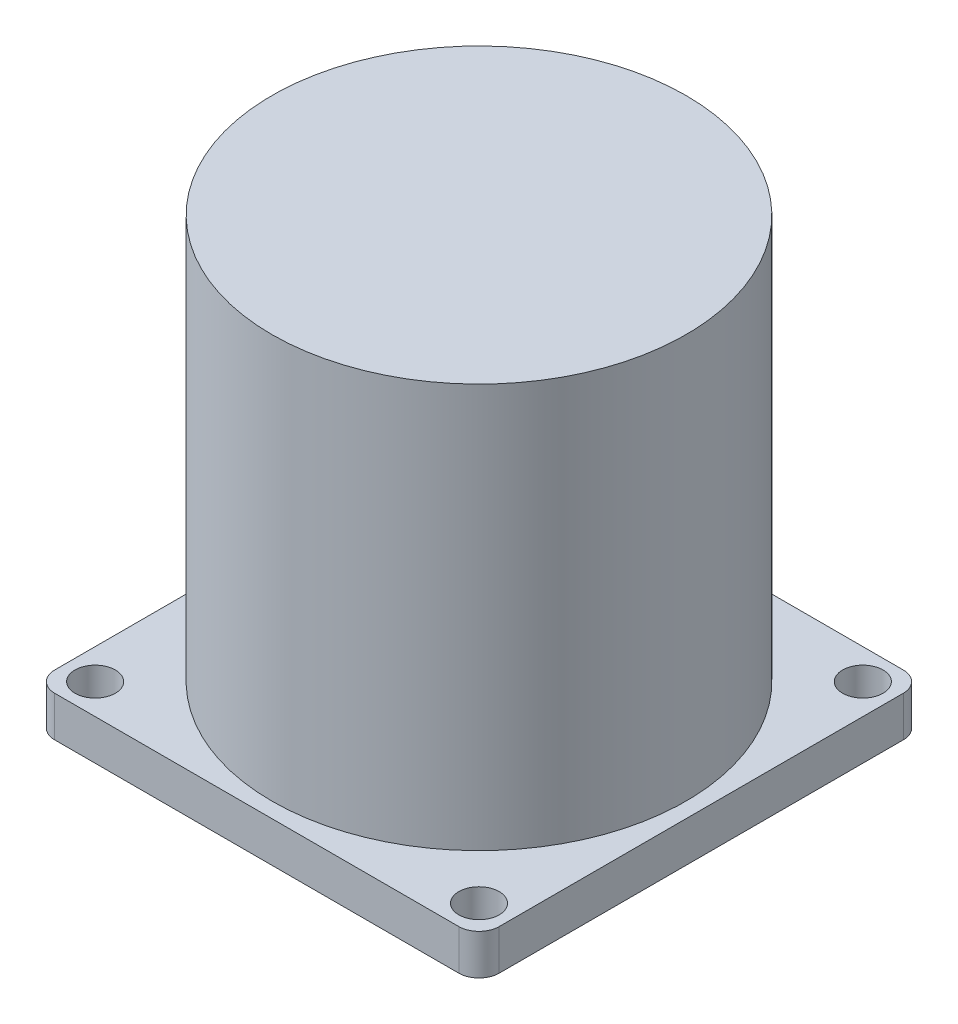
ISO-10303-21;
HEADER;
FILE_DESCRIPTION(('STEP AP214'),'2;1');
FILE_NAME('part.step','',(''),(''),'','','');
FILE_SCHEMA(('AUTOMOTIVE_DESIGN { 1 0 10303 214 1 1 1 1 }'));
ENDSEC;
DATA;
#1=APPLICATION_CONTEXT('core data for automotive mechanical design processes');
#2=APPLICATION_PROTOCOL_DEFINITION('international standard','automotive_design',2000,#1);
#3=PRODUCT_CONTEXT('',#1,'mechanical');
#4=PRODUCT('Part','Part','',(#3));
#5=PRODUCT_RELATED_PRODUCT_CATEGORY('part','',(#4));
#6=PRODUCT_DEFINITION_FORMATION('','',#4);
#7=PRODUCT_DEFINITION_CONTEXT('part definition',#1,'design');
#8=PRODUCT_DEFINITION('design','',#6,#7);
#9=PRODUCT_DEFINITION_SHAPE('','',#8);
#10=(LENGTH_UNIT() NAMED_UNIT(*) SI_UNIT(.MILLI.,.METRE.));
#11=(NAMED_UNIT(*) PLANE_ANGLE_UNIT() SI_UNIT($,.RADIAN.));
#12=(NAMED_UNIT(*) SI_UNIT($,.STERADIAN.) SOLID_ANGLE_UNIT());
#13=UNCERTAINTY_MEASURE_WITH_UNIT(LENGTH_MEASURE(1.E-05),#10,'distance_accuracy_value','');
#14=(GEOMETRIC_REPRESENTATION_CONTEXT(3) GLOBAL_UNCERTAINTY_ASSIGNED_CONTEXT((#13)) GLOBAL_UNIT_ASSIGNED_CONTEXT((#10,
#11,#12)) REPRESENTATION_CONTEXT('',''));
#15=CARTESIAN_POINT('',(0.,0.,0.));
#16=DIRECTION('',(0.,0.,1.));
#17=DIRECTION('',(1.,0.,0.));
#18=AXIS2_PLACEMENT_3D('',#15,#16,#17);
#19=CARTESIAN_POINT('',(0.,20.,0.));
#20=DIRECTION('',(0.,1.,0.));
#21=DIRECTION('',(0.,0.,1.));
#22=AXIS2_PLACEMENT_3D('',#19,#20,#21);
#23=PLANE('',#22);
#24=CARTESIAN_POINT('',(0.,20.,0.));
#25=DIRECTION('',(0.,1.,0.));
#26=DIRECTION('',(0.,0.,1.));
#27=AXIS2_PLACEMENT_3D('',#24,#25,#26);
#28=CIRCLE('',#27,102.5);
#29=CARTESIAN_POINT('',(0.,20.,102.5));
#30=VERTEX_POINT('',#29);
#31=EDGE_CURVE('E11',#30,#30,#28,.T.);
#32=ORIENTED_EDGE('',*,*,#31,.F.);
#33=EDGE_LOOP('',(#32));
#34=FACE_BOUND('',#33,.T.);
#35=CARTESIAN_POINT('',(95.0000000000054,20.,94.9999999999947));
#36=DIRECTION('',(0.,1.,0.));
#37=DIRECTION('',(0.,0.,1.));
#38=AXIS2_PLACEMENT_3D('',#35,#36,#37);
#39=CIRCLE('',#38,10.0000000000075);
#40=CARTESIAN_POINT('',(95.0000000000054,20.,105.000000000002));
#41=VERTEX_POINT('',#40);
#42=EDGE_CURVE('E188',#41,#41,#39,.T.);
#43=ORIENTED_EDGE('',*,*,#42,.F.);
#44=EDGE_LOOP('',(#43));
#45=FACE_BOUND('',#44,.T.);
#46=CARTESIAN_POINT('',(-95.,20.,-95.));
#47=DIRECTION('',(0.,1.,0.));
#48=DIRECTION('',(0.,0.,1.));
#49=AXIS2_PLACEMENT_3D('',#46,#47,#48);
#50=CIRCLE('',#49,9.99999999999999);
#51=CARTESIAN_POINT('',(-95.,20.,-85.));
#52=VERTEX_POINT('',#51);
#53=EDGE_CURVE('E131',#52,#52,#50,.T.);
#54=ORIENTED_EDGE('',*,*,#53,.F.);
#55=EDGE_LOOP('',(#54));
#56=FACE_BOUND('',#55,.T.);
#57=DIRECTION('',(1.,0.,0.));
#58=VECTOR('',#57,1.);
#59=CARTESIAN_POINT('',(-110.,20.,110.));
#60=LINE('',#59,#58);
#61=CARTESIAN_POINT('',(-100.,20.,110.));
#62=VERTEX_POINT('',#61);
#63=CARTESIAN_POINT('',(99.9999999999999,20.,110.));
#64=VERTEX_POINT('',#63);
#65=EDGE_CURVE('E140',#62,#64,#60,.T.);
#66=ORIENTED_EDGE('',*,*,#65,.T.);
#67=CARTESIAN_POINT('',(99.9999999999999,20.,99.9999999999999));
#68=DIRECTION('',(0.,1.,0.));
#69=DIRECTION('',(0.,0.,1.));
#70=AXIS2_PLACEMENT_3D('',#67,#68,#69);
#71=CIRCLE('',#70,10.);
#72=CARTESIAN_POINT('',(110.,20.,99.9999999999999));
#73=VERTEX_POINT('',#72);
#74=EDGE_CURVE('E159',#64,#73,#71,.T.);
#75=ORIENTED_EDGE('',*,*,#74,.T.);
#76=DIRECTION('',(0.,0.,-1.));
#77=VECTOR('',#76,1.);
#78=CARTESIAN_POINT('',(110.,20.,-110.));
#79=LINE('',#78,#77);
#80=CARTESIAN_POINT('',(110.,20.,-100.));
#81=VERTEX_POINT('',#80);
#82=EDGE_CURVE('E123',#73,#81,#79,.T.);
#83=ORIENTED_EDGE('',*,*,#82,.T.);
#84=CARTESIAN_POINT('',(99.9999999999999,20.,-100.));
#85=DIRECTION('',(0.,1.,0.));
#86=DIRECTION('',(0.,0.,1.));
#87=AXIS2_PLACEMENT_3D('',#84,#85,#86);
#88=CIRCLE('',#87,10.);
#89=CARTESIAN_POINT('',(99.9999999999999,20.,-110.));
#90=VERTEX_POINT('',#89);
#91=EDGE_CURVE('E157',#81,#90,#88,.T.);
#92=ORIENTED_EDGE('',*,*,#91,.T.);
#93=DIRECTION('',(-1.,0.,0.));
#94=VECTOR('',#93,1.);
#95=CARTESIAN_POINT('',(-110.,20.,-110.));
#96=LINE('',#95,#94);
#97=CARTESIAN_POINT('',(-100.,20.,-110.));
#98=VERTEX_POINT('',#97);
#99=EDGE_CURVE('E178',#90,#98,#96,.T.);
#100=ORIENTED_EDGE('',*,*,#99,.T.);
#101=CARTESIAN_POINT('',(-100.,20.,-100.));
#102=DIRECTION('',(0.,1.,0.));
#103=DIRECTION('',(0.,0.,1.));
#104=AXIS2_PLACEMENT_3D('',#101,#102,#103);
#105=CIRCLE('',#104,10.);
#106=CARTESIAN_POINT('',(-110.,20.,-100.));
#107=VERTEX_POINT('',#106);
#108=EDGE_CURVE('E58',#98,#107,#105,.T.);
#109=ORIENTED_EDGE('',*,*,#108,.T.);
#110=DIRECTION('',(0.,0.,1.));
#111=VECTOR('',#110,1.);
#112=CARTESIAN_POINT('',(-110.,20.,-110.));
#113=LINE('',#112,#111);
#114=CARTESIAN_POINT('',(-110.,20.,99.9999999999999));
#115=VERTEX_POINT('',#114);
#116=EDGE_CURVE('E169',#107,#115,#113,.T.);
#117=ORIENTED_EDGE('',*,*,#116,.T.);
#118=CARTESIAN_POINT('',(-100.,20.,99.9999999999999));
#119=DIRECTION('',(0.,1.,0.));
#120=DIRECTION('',(0.,0.,1.));
#121=AXIS2_PLACEMENT_3D('',#118,#119,#120);
#122=CIRCLE('',#121,10.);
#123=EDGE_CURVE('E154',#115,#62,#122,.T.);
#124=ORIENTED_EDGE('',*,*,#123,.T.);
#125=EDGE_LOOP('',(#66,#75,#83,#92,#100,#109,#117,#124));
#126=FACE_BOUND('',#125,.T.);
#127=CARTESIAN_POINT('',(95.,20.,-95.0000000000054));
#128=DIRECTION('',(0.,1.,0.));
#129=DIRECTION('',(0.,0.,1.));
#130=AXIS2_PLACEMENT_3D('',#127,#128,#129);
#131=CIRCLE('',#130,10.0000000000055);
#132=CARTESIAN_POINT('',(95.,20.,-84.9999999999999));
#133=VERTEX_POINT('',#132);
#134=EDGE_CURVE('E183',#133,#133,#131,.T.);
#135=ORIENTED_EDGE('',*,*,#134,.F.);
#136=EDGE_LOOP('',(#135));
#137=FACE_BOUND('',#136,.T.);
#138=CARTESIAN_POINT('',(-94.9999999999947,20.,95.));
#139=DIRECTION('',(0.,1.,0.));
#140=DIRECTION('',(0.,0.,1.));
#141=AXIS2_PLACEMENT_3D('',#138,#139,#140);
#142=CIRCLE('',#141,10.0000000000028);
#143=CARTESIAN_POINT('',(-94.9999999999947,20.,105.000000000003));
#144=VERTEX_POINT('',#143);
#145=EDGE_CURVE('E194',#144,#144,#142,.T.);
#146=ORIENTED_EDGE('',*,*,#145,.F.);
#147=EDGE_LOOP('',(#146));
#148=FACE_BOUND('',#147,.T.);
#149=ADVANCED_FACE('F35',(#34,#45,#56,#126,#137,#148),#23,.T.);
#150=CARTESIAN_POINT('',(0.,0.,0.));
#151=DIRECTION('',(0.,1.,0.));
#152=DIRECTION('',(0.,0.,1.));
#153=AXIS2_PLACEMENT_3D('',#150,#151,#152);
#154=PLANE('',#153);
#155=DIRECTION('',(0.,0.,-1.));
#156=VECTOR('',#155,1.);
#157=CARTESIAN_POINT('',(110.,0.,-110.));
#158=LINE('',#157,#156);
#159=CARTESIAN_POINT('',(110.,0.,99.9999999999999));
#160=VERTEX_POINT('',#159);
#161=CARTESIAN_POINT('',(110.,0.,-100.));
#162=VERTEX_POINT('',#161);
#163=EDGE_CURVE('E120',#160,#162,#158,.T.);
#164=ORIENTED_EDGE('',*,*,#163,.F.);
#165=CARTESIAN_POINT('',(99.9999999999999,0.,99.9999999999999));
#166=DIRECTION('',(0.,1.,0.));
#167=DIRECTION('',(0.,0.,1.));
#168=AXIS2_PLACEMENT_3D('',#165,#166,#167);
#169=CIRCLE('',#168,10.);
#170=CARTESIAN_POINT('',(99.9999999999999,0.,110.));
#171=VERTEX_POINT('',#170);
#172=EDGE_CURVE('E103',#160,#171,#169,.F.);
#173=ORIENTED_EDGE('',*,*,#172,.T.);
#174=DIRECTION('',(1.,0.,0.));
#175=VECTOR('',#174,1.);
#176=CARTESIAN_POINT('',(-110.,0.,110.));
#177=LINE('',#176,#175);
#178=CARTESIAN_POINT('',(-100.,0.,110.));
#179=VERTEX_POINT('',#178);
#180=EDGE_CURVE('E144',#179,#171,#177,.T.);
#181=ORIENTED_EDGE('',*,*,#180,.F.);
#182=CARTESIAN_POINT('',(-100.,0.,99.9999999999999));
#183=DIRECTION('',(0.,1.,0.));
#184=DIRECTION('',(0.,0.,1.));
#185=AXIS2_PLACEMENT_3D('',#182,#183,#184);
#186=CIRCLE('',#185,10.);
#187=CARTESIAN_POINT('',(-110.,0.,99.9999999999999));
#188=VERTEX_POINT('',#187);
#189=EDGE_CURVE('E124',#179,#188,#186,.F.);
#190=ORIENTED_EDGE('',*,*,#189,.T.);
#191=DIRECTION('',(0.,0.,1.));
#192=VECTOR('',#191,1.);
#193=CARTESIAN_POINT('',(-110.,0.,-110.));
#194=LINE('',#193,#192);
#195=CARTESIAN_POINT('',(-110.,0.,-100.));
#196=VERTEX_POINT('',#195);
#197=EDGE_CURVE('E134',#196,#188,#194,.T.);
#198=ORIENTED_EDGE('',*,*,#197,.F.);
#199=CARTESIAN_POINT('',(-100.,0.,-100.));
#200=DIRECTION('',(0.,1.,0.));
#201=DIRECTION('',(0.,0.,1.));
#202=AXIS2_PLACEMENT_3D('',#199,#200,#201);
#203=CIRCLE('',#202,10.);
#204=CARTESIAN_POINT('',(-100.,0.,-110.));
#205=VERTEX_POINT('',#204);
#206=EDGE_CURVE('E148',#196,#205,#203,.F.);
#207=ORIENTED_EDGE('',*,*,#206,.T.);
#208=DIRECTION('',(-1.,0.,0.));
#209=VECTOR('',#208,1.);
#210=CARTESIAN_POINT('',(-110.,0.,-110.));
#211=LINE('',#210,#209);
#212=CARTESIAN_POINT('',(99.9999999999999,0.,-110.));
#213=VERTEX_POINT('',#212);
#214=EDGE_CURVE('E130',#213,#205,#211,.T.);
#215=ORIENTED_EDGE('',*,*,#214,.F.);
#216=CARTESIAN_POINT('',(99.9999999999999,0.,-100.));
#217=DIRECTION('',(0.,1.,0.));
#218=DIRECTION('',(0.,0.,1.));
#219=AXIS2_PLACEMENT_3D('',#216,#217,#218);
#220=CIRCLE('',#219,10.);
#221=EDGE_CURVE('E114',#213,#162,#220,.F.);
#222=ORIENTED_EDGE('',*,*,#221,.T.);
#223=EDGE_LOOP('',(#164,#173,#181,#190,#198,#207,#215,#222));
#224=FACE_BOUND('',#223,.T.);
#225=CARTESIAN_POINT('',(-95.,0.,-95.));
#226=DIRECTION('',(0.,1.,0.));
#227=DIRECTION('',(0.,0.,1.));
#228=AXIS2_PLACEMENT_3D('',#225,#226,#227);
#229=CIRCLE('',#228,9.99999999999999);
#230=CARTESIAN_POINT('',(-95.,0.,-85.));
#231=VERTEX_POINT('',#230);
#232=EDGE_CURVE('E137',#231,#231,#229,.T.);
#233=ORIENTED_EDGE('',*,*,#232,.T.);
#234=EDGE_LOOP('',(#233));
#235=FACE_BOUND('',#234,.T.);
#236=CARTESIAN_POINT('',(95.,0.,-95.0000000000054));
#237=DIRECTION('',(0.,1.,0.));
#238=DIRECTION('',(0.,0.,1.));
#239=AXIS2_PLACEMENT_3D('',#236,#237,#238);
#240=CIRCLE('',#239,10.0000000000055);
#241=CARTESIAN_POINT('',(95.,0.,-84.9999999999999));
#242=VERTEX_POINT('',#241);
#243=EDGE_CURVE('E185',#242,#242,#240,.T.);
#244=ORIENTED_EDGE('',*,*,#243,.T.);
#245=EDGE_LOOP('',(#244));
#246=FACE_BOUND('',#245,.T.);
#247=CARTESIAN_POINT('',(95.0000000000054,0.,94.9999999999947));
#248=DIRECTION('',(0.,1.,0.));
#249=DIRECTION('',(0.,0.,1.));
#250=AXIS2_PLACEMENT_3D('',#247,#248,#249);
#251=CIRCLE('',#250,10.0000000000075);
#252=CARTESIAN_POINT('',(95.0000000000054,0.,105.000000000002));
#253=VERTEX_POINT('',#252);
#254=EDGE_CURVE('E191',#253,#253,#251,.T.);
#255=ORIENTED_EDGE('',*,*,#254,.T.);
#256=EDGE_LOOP('',(#255));
#257=FACE_BOUND('',#256,.T.);
#258=CARTESIAN_POINT('',(-94.9999999999947,0.,95.));
#259=DIRECTION('',(0.,1.,0.));
#260=DIRECTION('',(0.,0.,1.));
#261=AXIS2_PLACEMENT_3D('',#258,#259,#260);
#262=CIRCLE('',#261,10.0000000000028);
#263=CARTESIAN_POINT('',(-94.9999999999947,0.,105.000000000003));
#264=VERTEX_POINT('',#263);
#265=EDGE_CURVE('E197',#264,#264,#262,.T.);
#266=ORIENTED_EDGE('',*,*,#265,.T.);
#267=EDGE_LOOP('',(#266));
#268=FACE_BOUND('',#267,.T.);
#269=ADVANCED_FACE('F127',(#224,#235,#246,#257,#268),#154,.F.);
#270=CARTESIAN_POINT('',(110.,20.,-110.));
#271=DIRECTION('',(-1.,0.,0.));
#272=DIRECTION('',(0.,0.,1.));
#273=AXIS2_PLACEMENT_3D('',#270,#271,#272);
#274=PLANE('',#273);
#275=ORIENTED_EDGE('',*,*,#82,.F.);
#276=DIRECTION('',(0.,-1.,0.));
#277=VECTOR('',#276,1.);
#278=CARTESIAN_POINT('',(110.,20.,99.9999999999999));
#279=LINE('',#278,#277);
#280=EDGE_CURVE('E107',#73,#160,#279,.T.);
#281=ORIENTED_EDGE('',*,*,#280,.T.);
#282=ORIENTED_EDGE('',*,*,#163,.T.);
#283=DIRECTION('',(0.,-1.,0.));
#284=VECTOR('',#283,1.);
#285=CARTESIAN_POINT('',(110.,20.,-100.));
#286=LINE('',#285,#284);
#287=EDGE_CURVE('E125',#162,#81,#286,.F.);
#288=ORIENTED_EDGE('',*,*,#287,.T.);
#289=EDGE_LOOP('',(#275,#281,#282,#288));
#290=FACE_BOUND('',#289,.T.);
#291=ADVANCED_FACE('F119',(#290),#274,.F.);
#292=CARTESIAN_POINT('',(-110.,20.,-110.));
#293=DIRECTION('',(0.,0.,1.));
#294=DIRECTION('',(1.,0.,0.));
#295=AXIS2_PLACEMENT_3D('',#292,#293,#294);
#296=PLANE('',#295);
#297=ORIENTED_EDGE('',*,*,#99,.F.);
#298=DIRECTION('',(0.,-1.,0.));
#299=VECTOR('',#298,1.);
#300=CARTESIAN_POINT('',(99.9999999999999,20.,-110.));
#301=LINE('',#300,#299);
#302=EDGE_CURVE('E163',#90,#213,#301,.T.);
#303=ORIENTED_EDGE('',*,*,#302,.T.);
#304=ORIENTED_EDGE('',*,*,#214,.T.);
#305=DIRECTION('',(0.,-1.,0.));
#306=VECTOR('',#305,1.);
#307=CARTESIAN_POINT('',(-100.,20.,-110.));
#308=LINE('',#307,#306);
#309=EDGE_CURVE('E161',#205,#98,#308,.F.);
#310=ORIENTED_EDGE('',*,*,#309,.T.);
#311=EDGE_LOOP('',(#297,#303,#304,#310));
#312=FACE_BOUND('',#311,.T.);
#313=ADVANCED_FACE('F237',(#312),#296,.F.);
#314=CARTESIAN_POINT('',(-110.,20.,-110.));
#315=DIRECTION('',(1.,0.,0.));
#316=DIRECTION('',(0.,0.,-1.));
#317=AXIS2_PLACEMENT_3D('',#314,#315,#316);
#318=PLANE('',#317);
#319=ORIENTED_EDGE('',*,*,#116,.F.);
#320=DIRECTION('',(0.,-1.,0.));
#321=VECTOR('',#320,1.);
#322=CARTESIAN_POINT('',(-110.,20.,-100.));
#323=LINE('',#322,#321);
#324=EDGE_CURVE('E39',#107,#196,#323,.T.);
#325=ORIENTED_EDGE('',*,*,#324,.T.);
#326=ORIENTED_EDGE('',*,*,#197,.T.);
#327=DIRECTION('',(0.,-1.,0.));
#328=VECTOR('',#327,1.);
#329=CARTESIAN_POINT('',(-110.,20.,99.9999999999999));
#330=LINE('',#329,#328);
#331=EDGE_CURVE('E51',#188,#115,#330,.F.);
#332=ORIENTED_EDGE('',*,*,#331,.T.);
#333=EDGE_LOOP('',(#319,#325,#326,#332));
#334=FACE_BOUND('',#333,.T.);
#335=ADVANCED_FACE('F168',(#334),#318,.F.);
#336=CARTESIAN_POINT('',(-110.,20.,110.));
#337=DIRECTION('',(0.,0.,-1.));
#338=DIRECTION('',(-1.,0.,0.));
#339=AXIS2_PLACEMENT_3D('',#336,#337,#338);
#340=PLANE('',#339);
#341=ORIENTED_EDGE('',*,*,#180,.T.);
#342=DIRECTION('',(0.,-1.,0.));
#343=VECTOR('',#342,1.);
#344=CARTESIAN_POINT('',(99.9999999999999,20.,110.));
#345=LINE('',#344,#343);
#346=EDGE_CURVE('E108',#171,#64,#345,.F.);
#347=ORIENTED_EDGE('',*,*,#346,.T.);
#348=ORIENTED_EDGE('',*,*,#65,.F.);
#349=DIRECTION('',(0.,-1.,0.));
#350=VECTOR('',#349,1.);
#351=CARTESIAN_POINT('',(-100.,20.,110.));
#352=LINE('',#351,#350);
#353=EDGE_CURVE('E113',#62,#179,#352,.T.);
#354=ORIENTED_EDGE('',*,*,#353,.T.);
#355=EDGE_LOOP('',(#341,#347,#348,#354));
#356=FACE_BOUND('',#355,.T.);
#357=ADVANCED_FACE('F176',(#356),#340,.F.);
#358=CARTESIAN_POINT('',(-95.,20.,-95.));
#359=DIRECTION('',(0.,-1.,0.));
#360=DIRECTION('',(0.,0.,-1.));
#361=AXIS2_PLACEMENT_3D('',#358,#359,#360);
#362=CYLINDRICAL_SURFACE('',#361,9.99999999999999);
#363=ORIENTED_EDGE('',*,*,#53,.T.);
#364=EDGE_LOOP('',(#363));
#365=FACE_BOUND('',#364,.T.);
#366=ORIENTED_EDGE('',*,*,#232,.F.);
#367=EDGE_LOOP('',(#366));
#368=FACE_BOUND('',#367,.T.);
#369=ADVANCED_FACE('F243',(#365,#368),#362,.F.);
#370=CARTESIAN_POINT('',(95.,20.,-95.0000000000054));
#371=DIRECTION('',(0.,-1.,0.));
#372=DIRECTION('',(0.,0.,-1.));
#373=AXIS2_PLACEMENT_3D('',#370,#371,#372);
#374=CYLINDRICAL_SURFACE('',#373,10.0000000000055);
#375=ORIENTED_EDGE('',*,*,#134,.T.);
#376=EDGE_LOOP('',(#375));
#377=FACE_BOUND('',#376,.T.);
#378=ORIENTED_EDGE('',*,*,#243,.F.);
#379=EDGE_LOOP('',(#378));
#380=FACE_BOUND('',#379,.T.);
#381=ADVANCED_FACE('F310',(#377,#380),#374,.F.);
#382=CARTESIAN_POINT('',(95.0000000000054,20.,94.9999999999947));
#383=DIRECTION('',(0.,-1.,0.));
#384=DIRECTION('',(0.,0.,-1.));
#385=AXIS2_PLACEMENT_3D('',#382,#383,#384);
#386=CYLINDRICAL_SURFACE('',#385,10.0000000000075);
#387=ORIENTED_EDGE('',*,*,#42,.T.);
#388=EDGE_LOOP('',(#387));
#389=FACE_BOUND('',#388,.T.);
#390=ORIENTED_EDGE('',*,*,#254,.F.);
#391=EDGE_LOOP('',(#390));
#392=FACE_BOUND('',#391,.T.);
#393=ADVANCED_FACE('F228',(#389,#392),#386,.F.);
#394=CARTESIAN_POINT('',(-94.9999999999947,20.,95.));
#395=DIRECTION('',(0.,-1.,0.));
#396=DIRECTION('',(0.,0.,-1.));
#397=AXIS2_PLACEMENT_3D('',#394,#395,#396);
#398=CYLINDRICAL_SURFACE('',#397,10.0000000000028);
#399=ORIENTED_EDGE('',*,*,#145,.T.);
#400=EDGE_LOOP('',(#399));
#401=FACE_BOUND('',#400,.T.);
#402=ORIENTED_EDGE('',*,*,#265,.F.);
#403=EDGE_LOOP('',(#402));
#404=FACE_BOUND('',#403,.T.);
#405=ADVANCED_FACE('F225',(#401,#404),#398,.F.);
#406=CARTESIAN_POINT('',(99.9999999999999,20.,99.9999999999999));
#407=DIRECTION('',(0.,-1.,0.));
#408=DIRECTION('',(0.,0.,-1.));
#409=AXIS2_PLACEMENT_3D('',#406,#407,#408);
#410=CYLINDRICAL_SURFACE('',#409,10.);
#411=ORIENTED_EDGE('',*,*,#74,.F.);
#412=ORIENTED_EDGE('',*,*,#346,.F.);
#413=ORIENTED_EDGE('',*,*,#172,.F.);
#414=ORIENTED_EDGE('',*,*,#280,.F.);
#415=EDGE_LOOP('',(#411,#412,#413,#414));
#416=FACE_BOUND('',#415,.T.);
#417=ADVANCED_FACE('F106',(#416),#410,.T.);
#418=CARTESIAN_POINT('',(99.9999999999999,20.,-100.));
#419=DIRECTION('',(0.,-1.,0.));
#420=DIRECTION('',(0.,0.,-1.));
#421=AXIS2_PLACEMENT_3D('',#418,#419,#420);
#422=CYLINDRICAL_SURFACE('',#421,10.);
#423=ORIENTED_EDGE('',*,*,#91,.F.);
#424=ORIENTED_EDGE('',*,*,#287,.F.);
#425=ORIENTED_EDGE('',*,*,#221,.F.);
#426=ORIENTED_EDGE('',*,*,#302,.F.);
#427=EDGE_LOOP('',(#423,#424,#425,#426));
#428=FACE_BOUND('',#427,.T.);
#429=ADVANCED_FACE('F251',(#428),#422,.T.);
#430=CARTESIAN_POINT('',(-100.,20.,-100.));
#431=DIRECTION('',(0.,-1.,0.));
#432=DIRECTION('',(0.,0.,-1.));
#433=AXIS2_PLACEMENT_3D('',#430,#431,#432);
#434=CYLINDRICAL_SURFACE('',#433,10.);
#435=ORIENTED_EDGE('',*,*,#108,.F.);
#436=ORIENTED_EDGE('',*,*,#309,.F.);
#437=ORIENTED_EDGE('',*,*,#206,.F.);
#438=ORIENTED_EDGE('',*,*,#324,.F.);
#439=EDGE_LOOP('',(#435,#436,#437,#438));
#440=FACE_BOUND('',#439,.T.);
#441=ADVANCED_FACE('F253',(#440),#434,.T.);
#442=CARTESIAN_POINT('',(-100.,20.,99.9999999999999));
#443=DIRECTION('',(0.,-1.,0.));
#444=DIRECTION('',(0.,0.,-1.));
#445=AXIS2_PLACEMENT_3D('',#442,#443,#444);
#446=CYLINDRICAL_SURFACE('',#445,10.);
#447=ORIENTED_EDGE('',*,*,#123,.F.);
#448=ORIENTED_EDGE('',*,*,#331,.F.);
#449=ORIENTED_EDGE('',*,*,#189,.F.);
#450=ORIENTED_EDGE('',*,*,#353,.F.);
#451=EDGE_LOOP('',(#447,#448,#449,#450));
#452=FACE_BOUND('',#451,.T.);
#453=ADVANCED_FACE('F37',(#452),#446,.T.);
#454=CARTESIAN_POINT('',(0.,220.,0.));
#455=DIRECTION('',(0.,-1.,0.));
#456=DIRECTION('',(0.,0.,-1.));
#457=AXIS2_PLACEMENT_3D('',#454,#455,#456);
#458=CYLINDRICAL_SURFACE('',#457,102.5);
#459=CARTESIAN_POINT('',(0.,220.,0.));
#460=DIRECTION('',(0.,1.,0.));
#461=DIRECTION('',(0.,0.,1.));
#462=AXIS2_PLACEMENT_3D('',#459,#460,#461);
#463=CIRCLE('',#462,102.5);
#464=CARTESIAN_POINT('',(0.,220.,102.5));
#465=VERTEX_POINT('',#464);
#466=EDGE_CURVE('E200',#465,#465,#463,.T.);
#467=ORIENTED_EDGE('',*,*,#466,.F.);
#468=EDGE_LOOP('',(#467));
#469=FACE_BOUND('',#468,.T.);
#470=ORIENTED_EDGE('',*,*,#31,.T.);
#471=EDGE_LOOP('',(#470));
#472=FACE_BOUND('',#471,.T.);
#473=ADVANCED_FACE('F208',(#469,#472),#458,.T.);
#474=CARTESIAN_POINT('',(0.,220.,0.));
#475=DIRECTION('',(0.,1.,0.));
#476=DIRECTION('',(0.,0.,1.));
#477=AXIS2_PLACEMENT_3D('',#474,#475,#476);
#478=PLANE('',#477);
#479=ORIENTED_EDGE('',*,*,#466,.T.);
#480=EDGE_LOOP('',(#479));
#481=FACE_BOUND('',#480,.T.);
#482=ADVANCED_FACE('F206',(#481),#478,.T.);
#483=CLOSED_SHELL('',(#149,#269,#291,#313,#335,#357,#369,#381,#393,#405,#417,#429,#441,#453,
#473,#482));
#484=MANIFOLD_SOLID_BREP('B2',#483);
#485=ADVANCED_BREP_SHAPE_REPRESENTATION('',(#18,#484),#14);
#486=SHAPE_DEFINITION_REPRESENTATION(#9,#485);
ENDSEC;
END-ISO-10303-21;
